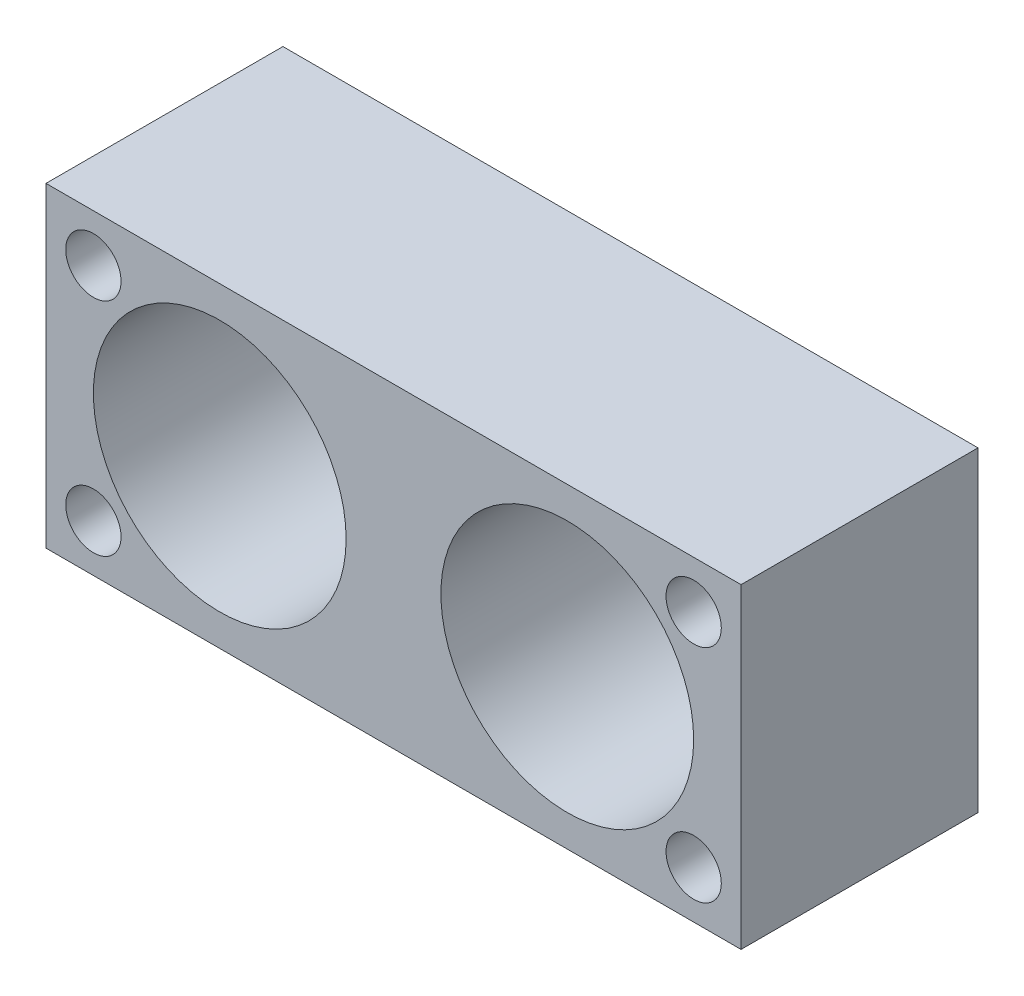
ISO-10303-21;
HEADER;
FILE_DESCRIPTION(('STEP AP214'),'2;1');
FILE_NAME('part.step','',(''),(''),'','','');
FILE_SCHEMA(('AUTOMOTIVE_DESIGN { 1 0 10303 214 1 1 1 1 }'));
ENDSEC;
DATA;
#1=APPLICATION_CONTEXT('core data for automotive mechanical design processes');
#2=APPLICATION_PROTOCOL_DEFINITION('international standard','automotive_design',2000,#1);
#3=PRODUCT_CONTEXT('',#1,'mechanical');
#4=PRODUCT('Part','Part','',(#3));
#5=PRODUCT_RELATED_PRODUCT_CATEGORY('part','',(#4));
#6=PRODUCT_DEFINITION_FORMATION('','',#4);
#7=PRODUCT_DEFINITION_CONTEXT('part definition',#1,'design');
#8=PRODUCT_DEFINITION('design','',#6,#7);
#9=PRODUCT_DEFINITION_SHAPE('','',#8);
#10=(LENGTH_UNIT() NAMED_UNIT(*) SI_UNIT(.MILLI.,.METRE.));
#11=(NAMED_UNIT(*) PLANE_ANGLE_UNIT() SI_UNIT($,.RADIAN.));
#12=(NAMED_UNIT(*) SI_UNIT($,.STERADIAN.) SOLID_ANGLE_UNIT());
#13=UNCERTAINTY_MEASURE_WITH_UNIT(LENGTH_MEASURE(1.E-05),#10,'distance_accuracy_value','');
#14=(GEOMETRIC_REPRESENTATION_CONTEXT(3) GLOBAL_UNCERTAINTY_ASSIGNED_CONTEXT((#13)) GLOBAL_UNIT_ASSIGNED_CONTEXT((#10,
#11,#12)) REPRESENTATION_CONTEXT('',''));
#15=CARTESIAN_POINT('',(0.,0.,0.));
#16=DIRECTION('',(0.,0.,1.));
#17=DIRECTION('',(1.,0.,0.));
#18=AXIS2_PLACEMENT_3D('',#15,#16,#17);
#19=CARTESIAN_POINT('',(0.,0.,15.));
#20=DIRECTION('',(0.,0.,1.));
#21=DIRECTION('',(1.,0.,0.));
#22=AXIS2_PLACEMENT_3D('',#19,#20,#21);
#23=PLANE('',#22);
#24=CARTESIAN_POINT('',(-19.,-7.,15.));
#25=DIRECTION('',(0.,0.,1.));
#26=DIRECTION('',(1.,0.,0.));
#27=AXIS2_PLACEMENT_3D('',#24,#25,#26);
#28=CIRCLE('',#27,1.75);
#29=CARTESIAN_POINT('',(-17.25,-7.,15.));
#30=VERTEX_POINT('',#29);
#31=EDGE_CURVE('E231',#30,#30,#28,.T.);
#32=ORIENTED_EDGE('',*,*,#31,.F.);
#33=EDGE_LOOP('',(#32));
#34=FACE_BOUND('',#33,.T.);
#35=CARTESIAN_POINT('',(19.,7.00000000000001,15.));
#36=DIRECTION('',(0.,0.,1.));
#37=DIRECTION('',(1.,0.,0.));
#38=AXIS2_PLACEMENT_3D('',#35,#36,#37);
#39=CIRCLE('',#38,1.75);
#40=CARTESIAN_POINT('',(20.75,7.00000000000001,15.));
#41=VERTEX_POINT('',#40);
#42=EDGE_CURVE('E232',#41,#41,#39,.T.);
#43=ORIENTED_EDGE('',*,*,#42,.F.);
#44=EDGE_LOOP('',(#43));
#45=FACE_BOUND('',#44,.T.);
#46=CARTESIAN_POINT('',(19.,-7.,15.));
#47=DIRECTION('',(0.,0.,1.));
#48=DIRECTION('',(1.,0.,0.));
#49=AXIS2_PLACEMENT_3D('',#46,#47,#48);
#50=CIRCLE('',#49,1.75);
#51=CARTESIAN_POINT('',(20.75,-7.,15.));
#52=VERTEX_POINT('',#51);
#53=EDGE_CURVE('E235',#52,#52,#50,.T.);
#54=ORIENTED_EDGE('',*,*,#53,.F.);
#55=EDGE_LOOP('',(#54));
#56=FACE_BOUND('',#55,.T.);
#57=CARTESIAN_POINT('',(-19.,7.00000000000001,15.));
#58=DIRECTION('',(0.,0.,1.));
#59=DIRECTION('',(1.,0.,0.));
#60=AXIS2_PLACEMENT_3D('',#57,#58,#59);
#61=CIRCLE('',#60,1.75);
#62=CARTESIAN_POINT('',(-17.25,7.00000000000001,15.));
#63=VERTEX_POINT('',#62);
#64=EDGE_CURVE('E117',#63,#63,#61,.T.);
#65=ORIENTED_EDGE('',*,*,#64,.F.);
#66=EDGE_LOOP('',(#65));
#67=FACE_BOUND('',#66,.T.);
#68=CARTESIAN_POINT('',(-11.,0.,15.));
#69=DIRECTION('',(0.,0.,1.));
#70=DIRECTION('',(1.,0.,0.));
#71=AXIS2_PLACEMENT_3D('',#68,#69,#70);
#72=CIRCLE('',#71,8.);
#73=CARTESIAN_POINT('',(-3.,0.,15.));
#74=VERTEX_POINT('',#73);
#75=EDGE_CURVE('E107',#74,#74,#72,.T.);
#76=ORIENTED_EDGE('',*,*,#75,.F.);
#77=EDGE_LOOP('',(#76));
#78=FACE_BOUND('',#77,.T.);
#79=DIRECTION('',(0.,-1.,0.));
#80=VECTOR('',#79,1.);
#81=CARTESIAN_POINT('',(-22.,10.,15.));
#82=LINE('',#81,#80);
#83=CARTESIAN_POINT('',(-22.,10.,15.));
#84=VERTEX_POINT('',#83);
#85=CARTESIAN_POINT('',(-22.,-10.,15.));
#86=VERTEX_POINT('',#85);
#87=EDGE_CURVE('E91',#84,#86,#82,.T.);
#88=ORIENTED_EDGE('',*,*,#87,.T.);
#89=DIRECTION('',(1.,0.,0.));
#90=VECTOR('',#89,1.);
#91=CARTESIAN_POINT('',(-22.,-10.,15.));
#92=LINE('',#91,#90);
#93=CARTESIAN_POINT('',(22.,-9.99999999999999,15.));
#94=VERTEX_POINT('',#93);
#95=EDGE_CURVE('E86',#86,#94,#92,.T.);
#96=ORIENTED_EDGE('',*,*,#95,.T.);
#97=DIRECTION('',(0.,1.,0.));
#98=VECTOR('',#97,1.);
#99=CARTESIAN_POINT('',(22.,10.,15.));
#100=LINE('',#99,#98);
#101=CARTESIAN_POINT('',(22.,10.,15.));
#102=VERTEX_POINT('',#101);
#103=EDGE_CURVE('E89',#94,#102,#100,.T.);
#104=ORIENTED_EDGE('',*,*,#103,.T.);
#105=DIRECTION('',(-1.,0.,0.));
#106=VECTOR('',#105,1.);
#107=CARTESIAN_POINT('',(-22.,10.,15.));
#108=LINE('',#107,#106);
#109=EDGE_CURVE('E56',#102,#84,#108,.T.);
#110=ORIENTED_EDGE('',*,*,#109,.T.);
#111=EDGE_LOOP('',(#88,#96,#104,#110));
#112=FACE_BOUND('',#111,.T.);
#113=CARTESIAN_POINT('',(11.,0.,15.));
#114=DIRECTION('',(0.,0.,1.));
#115=DIRECTION('',(1.,0.,0.));
#116=AXIS2_PLACEMENT_3D('',#113,#114,#115);
#117=CIRCLE('',#116,8.);
#118=CARTESIAN_POINT('',(19.,0.,15.));
#119=VERTEX_POINT('',#118);
#120=EDGE_CURVE('E128',#119,#119,#117,.T.);
#121=ORIENTED_EDGE('',*,*,#120,.F.);
#122=EDGE_LOOP('',(#121));
#123=FACE_BOUND('',#122,.T.);
#124=ADVANCED_FACE('F37',(#34,#45,#56,#67,#78,#112,#123),#23,.T.);
#125=CARTESIAN_POINT('',(0.,0.,0.));
#126=DIRECTION('',(0.,0.,1.));
#127=DIRECTION('',(1.,0.,0.));
#128=AXIS2_PLACEMENT_3D('',#125,#126,#127);
#129=PLANE('',#128);
#130=CARTESIAN_POINT('',(-19.,-7.,0.));
#131=DIRECTION('',(0.,0.,1.));
#132=DIRECTION('',(1.,0.,0.));
#133=AXIS2_PLACEMENT_3D('',#130,#131,#132);
#134=CIRCLE('',#133,1.75);
#135=CARTESIAN_POINT('',(-17.25,-7.,0.));
#136=VERTEX_POINT('',#135);
#137=EDGE_CURVE('E41',#136,#136,#134,.T.);
#138=ORIENTED_EDGE('',*,*,#137,.T.);
#139=EDGE_LOOP('',(#138));
#140=FACE_BOUND('',#139,.T.);
#141=CARTESIAN_POINT('',(19.,7.00000000000001,0.));
#142=DIRECTION('',(0.,0.,1.));
#143=DIRECTION('',(1.,0.,0.));
#144=AXIS2_PLACEMENT_3D('',#141,#142,#143);
#145=CIRCLE('',#144,1.75);
#146=CARTESIAN_POINT('',(20.75,7.00000000000001,0.));
#147=VERTEX_POINT('',#146);
#148=EDGE_CURVE('E119',#147,#147,#145,.T.);
#149=ORIENTED_EDGE('',*,*,#148,.T.);
#150=EDGE_LOOP('',(#149));
#151=FACE_BOUND('',#150,.T.);
#152=CARTESIAN_POINT('',(19.,-7.,0.));
#153=DIRECTION('',(0.,0.,1.));
#154=DIRECTION('',(1.,0.,0.));
#155=AXIS2_PLACEMENT_3D('',#152,#153,#154);
#156=CIRCLE('',#155,1.75);
#157=CARTESIAN_POINT('',(20.75,-7.,0.));
#158=VERTEX_POINT('',#157);
#159=EDGE_CURVE('E116',#158,#158,#156,.T.);
#160=ORIENTED_EDGE('',*,*,#159,.T.);
#161=EDGE_LOOP('',(#160));
#162=FACE_BOUND('',#161,.T.);
#163=CARTESIAN_POINT('',(-19.,7.00000000000001,0.));
#164=DIRECTION('',(0.,0.,1.));
#165=DIRECTION('',(1.,0.,0.));
#166=AXIS2_PLACEMENT_3D('',#163,#164,#165);
#167=CIRCLE('',#166,1.75);
#168=CARTESIAN_POINT('',(-17.25,7.00000000000001,0.));
#169=VERTEX_POINT('',#168);
#170=EDGE_CURVE('E113',#169,#169,#167,.T.);
#171=ORIENTED_EDGE('',*,*,#170,.T.);
#172=EDGE_LOOP('',(#171));
#173=FACE_BOUND('',#172,.T.);
#174=DIRECTION('',(0.,-1.,0.));
#175=VECTOR('',#174,1.);
#176=CARTESIAN_POINT('',(-22.,10.,0.));
#177=LINE('',#176,#175);
#178=CARTESIAN_POINT('',(-22.,10.,0.));
#179=VERTEX_POINT('',#178);
#180=CARTESIAN_POINT('',(-22.,-10.,0.));
#181=VERTEX_POINT('',#180);
#182=EDGE_CURVE('E104',#179,#181,#177,.T.);
#183=ORIENTED_EDGE('',*,*,#182,.F.);
#184=DIRECTION('',(-1.,0.,0.));
#185=VECTOR('',#184,1.);
#186=CARTESIAN_POINT('',(-22.,10.,0.));
#187=LINE('',#186,#185);
#188=CARTESIAN_POINT('',(22.,10.,0.));
#189=VERTEX_POINT('',#188);
#190=EDGE_CURVE('E79',#189,#179,#187,.T.);
#191=ORIENTED_EDGE('',*,*,#190,.F.);
#192=DIRECTION('',(0.,1.,0.));
#193=VECTOR('',#192,1.);
#194=CARTESIAN_POINT('',(22.,10.,0.));
#195=LINE('',#194,#193);
#196=CARTESIAN_POINT('',(22.,-9.99999999999999,0.));
#197=VERTEX_POINT('',#196);
#198=EDGE_CURVE('E73',#197,#189,#195,.T.);
#199=ORIENTED_EDGE('',*,*,#198,.F.);
#200=DIRECTION('',(1.,0.,0.));
#201=VECTOR('',#200,1.);
#202=CARTESIAN_POINT('',(-22.,-10.,0.));
#203=LINE('',#202,#201);
#204=EDGE_CURVE('E95',#181,#197,#203,.T.);
#205=ORIENTED_EDGE('',*,*,#204,.F.);
#206=EDGE_LOOP('',(#183,#191,#199,#205));
#207=FACE_BOUND('',#206,.T.);
#208=CARTESIAN_POINT('',(-11.,0.,0.));
#209=DIRECTION('',(0.,0.,1.));
#210=DIRECTION('',(1.,0.,0.));
#211=AXIS2_PLACEMENT_3D('',#208,#209,#210);
#212=CIRCLE('',#211,8.);
#213=CARTESIAN_POINT('',(-3.,0.,0.));
#214=VERTEX_POINT('',#213);
#215=EDGE_CURVE('E133',#214,#214,#212,.T.);
#216=ORIENTED_EDGE('',*,*,#215,.T.);
#217=EDGE_LOOP('',(#216));
#218=FACE_BOUND('',#217,.T.);
#219=CARTESIAN_POINT('',(11.,0.,0.));
#220=DIRECTION('',(0.,0.,1.));
#221=DIRECTION('',(1.,0.,0.));
#222=AXIS2_PLACEMENT_3D('',#219,#220,#221);
#223=CIRCLE('',#222,8.);
#224=CARTESIAN_POINT('',(19.,0.,0.));
#225=VERTEX_POINT('',#224);
#226=EDGE_CURVE('E124',#225,#225,#223,.T.);
#227=ORIENTED_EDGE('',*,*,#226,.T.);
#228=EDGE_LOOP('',(#227));
#229=FACE_BOUND('',#228,.T.);
#230=ADVANCED_FACE('F142',(#140,#151,#162,#173,#207,#218,#229),#129,.F.);
#231=CARTESIAN_POINT('',(-22.,10.,15.));
#232=DIRECTION('',(1.,0.,0.));
#233=DIRECTION('',(0.,0.,-1.));
#234=AXIS2_PLACEMENT_3D('',#231,#232,#233);
#235=PLANE('',#234);
#236=ORIENTED_EDGE('',*,*,#182,.T.);
#237=DIRECTION('',(0.,0.,-1.));
#238=VECTOR('',#237,1.);
#239=CARTESIAN_POINT('',(-22.,-10.,15.));
#240=LINE('',#239,#238);
#241=EDGE_CURVE('E11',#86,#181,#240,.T.);
#242=ORIENTED_EDGE('',*,*,#241,.F.);
#243=ORIENTED_EDGE('',*,*,#87,.F.);
#244=DIRECTION('',(0.,0.,-1.));
#245=VECTOR('',#244,1.);
#246=CARTESIAN_POINT('',(-22.,10.,15.));
#247=LINE('',#246,#245);
#248=EDGE_CURVE('E100',#84,#179,#247,.T.);
#249=ORIENTED_EDGE('',*,*,#248,.T.);
#250=EDGE_LOOP('',(#236,#242,#243,#249));
#251=FACE_BOUND('',#250,.T.);
#252=ADVANCED_FACE('F39',(#251),#235,.F.);
#253=CARTESIAN_POINT('',(-22.,-10.,15.));
#254=DIRECTION('',(0.,1.,0.));
#255=DIRECTION('',(-1.,0.,0.));
#256=AXIS2_PLACEMENT_3D('',#253,#254,#255);
#257=PLANE('',#256);
#258=ORIENTED_EDGE('',*,*,#204,.T.);
#259=DIRECTION('',(0.,0.,-1.));
#260=VECTOR('',#259,1.);
#261=CARTESIAN_POINT('',(22.,-9.99999999999999,15.));
#262=LINE('',#261,#260);
#263=EDGE_CURVE('E47',#94,#197,#262,.T.);
#264=ORIENTED_EDGE('',*,*,#263,.F.);
#265=ORIENTED_EDGE('',*,*,#95,.F.);
#266=ORIENTED_EDGE('',*,*,#241,.T.);
#267=EDGE_LOOP('',(#258,#264,#265,#266));
#268=FACE_BOUND('',#267,.T.);
#269=ADVANCED_FACE('F94',(#268),#257,.F.);
#270=CARTESIAN_POINT('',(22.,10.,15.));
#271=DIRECTION('',(-1.,0.,0.));
#272=DIRECTION('',(0.,-1.,0.));
#273=AXIS2_PLACEMENT_3D('',#270,#271,#272);
#274=PLANE('',#273);
#275=ORIENTED_EDGE('',*,*,#198,.T.);
#276=DIRECTION('',(0.,0.,-1.));
#277=VECTOR('',#276,1.);
#278=CARTESIAN_POINT('',(22.,10.,15.));
#279=LINE('',#278,#277);
#280=EDGE_CURVE('E96',#102,#189,#279,.T.);
#281=ORIENTED_EDGE('',*,*,#280,.F.);
#282=ORIENTED_EDGE('',*,*,#103,.F.);
#283=ORIENTED_EDGE('',*,*,#263,.T.);
#284=EDGE_LOOP('',(#275,#281,#282,#283));
#285=FACE_BOUND('',#284,.T.);
#286=ADVANCED_FACE('F98',(#285),#274,.F.);
#287=CARTESIAN_POINT('',(-22.,10.,15.));
#288=DIRECTION('',(0.,-1.,0.));
#289=DIRECTION('',(1.,0.,0.));
#290=AXIS2_PLACEMENT_3D('',#287,#288,#289);
#291=PLANE('',#290);
#292=ORIENTED_EDGE('',*,*,#190,.T.);
#293=ORIENTED_EDGE('',*,*,#248,.F.);
#294=ORIENTED_EDGE('',*,*,#109,.F.);
#295=ORIENTED_EDGE('',*,*,#280,.T.);
#296=EDGE_LOOP('',(#292,#293,#294,#295));
#297=FACE_BOUND('',#296,.T.);
#298=ADVANCED_FACE('F147',(#297),#291,.F.);
#299=CARTESIAN_POINT('',(-11.,0.,15.));
#300=DIRECTION('',(0.,0.,-1.));
#301=DIRECTION('',(-1.,0.,0.));
#302=AXIS2_PLACEMENT_3D('',#299,#300,#301);
#303=CYLINDRICAL_SURFACE('',#302,8.);
#304=ORIENTED_EDGE('',*,*,#75,.T.);
#305=EDGE_LOOP('',(#304));
#306=FACE_BOUND('',#305,.T.);
#307=ORIENTED_EDGE('',*,*,#215,.F.);
#308=EDGE_LOOP('',(#307));
#309=FACE_BOUND('',#308,.T.);
#310=ADVANCED_FACE('F144',(#306,#309),#303,.F.);
#311=CARTESIAN_POINT('',(11.,0.,15.));
#312=DIRECTION('',(0.,0.,-1.));
#313=DIRECTION('',(-1.,0.,0.));
#314=AXIS2_PLACEMENT_3D('',#311,#312,#313);
#315=CYLINDRICAL_SURFACE('',#314,8.);
#316=ORIENTED_EDGE('',*,*,#120,.T.);
#317=EDGE_LOOP('',(#316));
#318=FACE_BOUND('',#317,.T.);
#319=ORIENTED_EDGE('',*,*,#226,.F.);
#320=EDGE_LOOP('',(#319));
#321=FACE_BOUND('',#320,.T.);
#322=ADVANCED_FACE('F146',(#318,#321),#315,.F.);
#323=CARTESIAN_POINT('',(-19.,7.00000000000001,-7.));
#324=DIRECTION('',(0.,0.,1.));
#325=DIRECTION('',(1.,0.,0.));
#326=AXIS2_PLACEMENT_3D('',#323,#324,#325);
#327=CYLINDRICAL_SURFACE('',#326,1.75);
#328=ORIENTED_EDGE('',*,*,#64,.T.);
#329=EDGE_LOOP('',(#328));
#330=FACE_BOUND('',#329,.T.);
#331=ORIENTED_EDGE('',*,*,#170,.F.);
#332=EDGE_LOOP('',(#331));
#333=FACE_BOUND('',#332,.T.);
#334=ADVANCED_FACE('F154',(#330,#333),#327,.F.);
#335=CARTESIAN_POINT('',(19.,-7.,-7.));
#336=DIRECTION('',(0.,0.,1.));
#337=DIRECTION('',(1.,0.,0.));
#338=AXIS2_PLACEMENT_3D('',#335,#336,#337);
#339=CYLINDRICAL_SURFACE('',#338,1.75);
#340=ORIENTED_EDGE('',*,*,#53,.T.);
#341=EDGE_LOOP('',(#340));
#342=FACE_BOUND('',#341,.T.);
#343=ORIENTED_EDGE('',*,*,#159,.F.);
#344=EDGE_LOOP('',(#343));
#345=FACE_BOUND('',#344,.T.);
#346=ADVANCED_FACE('F194',(#342,#345),#339,.F.);
#347=CARTESIAN_POINT('',(19.,7.00000000000001,-7.));
#348=DIRECTION('',(0.,0.,1.));
#349=DIRECTION('',(1.,0.,0.));
#350=AXIS2_PLACEMENT_3D('',#347,#348,#349);
#351=CYLINDRICAL_SURFACE('',#350,1.75);
#352=ORIENTED_EDGE('',*,*,#42,.T.);
#353=EDGE_LOOP('',(#352));
#354=FACE_BOUND('',#353,.T.);
#355=ORIENTED_EDGE('',*,*,#148,.F.);
#356=EDGE_LOOP('',(#355));
#357=FACE_BOUND('',#356,.T.);
#358=ADVANCED_FACE('F205',(#354,#357),#351,.F.);
#359=CARTESIAN_POINT('',(-19.,-7.,-7.));
#360=DIRECTION('',(0.,0.,1.));
#361=DIRECTION('',(1.,0.,0.));
#362=AXIS2_PLACEMENT_3D('',#359,#360,#361);
#363=CYLINDRICAL_SURFACE('',#362,1.75);
#364=ORIENTED_EDGE('',*,*,#31,.T.);
#365=EDGE_LOOP('',(#364));
#366=FACE_BOUND('',#365,.T.);
#367=ORIENTED_EDGE('',*,*,#137,.F.);
#368=EDGE_LOOP('',(#367));
#369=FACE_BOUND('',#368,.T.);
#370=ADVANCED_FACE('F215',(#366,#369),#363,.F.);
#371=CLOSED_SHELL('',(#124,#230,#252,#269,#286,#298,#310,#322,#334,#346,#358,#370));
#372=MANIFOLD_SOLID_BREP('B2',#371);
#373=ADVANCED_BREP_SHAPE_REPRESENTATION('',(#18,#372),#14);
#374=SHAPE_DEFINITION_REPRESENTATION(#9,#373);
ENDSEC;
END-ISO-10303-21;
